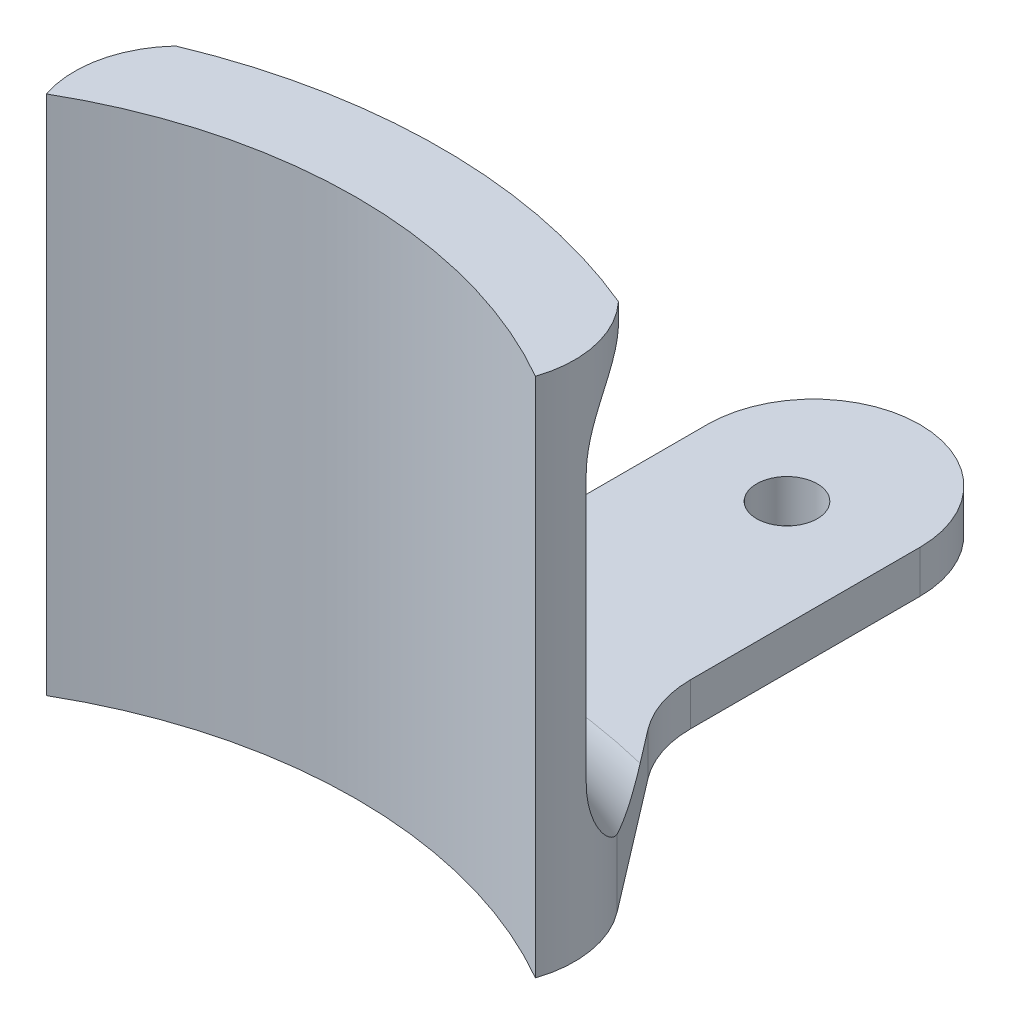
ISO-10303-21;
HEADER;
FILE_DESCRIPTION(('STEP AP214'),'2;1');
FILE_NAME('part.step','',(''),(''),'','','');
FILE_SCHEMA(('AUTOMOTIVE_DESIGN { 1 0 10303 214 1 1 1 1 }'));
ENDSEC;
DATA;
#1=APPLICATION_CONTEXT('core data for automotive mechanical design processes');
#2=APPLICATION_PROTOCOL_DEFINITION('international standard','automotive_design',2000,#1);
#3=PRODUCT_CONTEXT('',#1,'mechanical');
#4=PRODUCT('Part','Part','',(#3));
#5=PRODUCT_RELATED_PRODUCT_CATEGORY('part','',(#4));
#6=PRODUCT_DEFINITION_FORMATION('','',#4);
#7=PRODUCT_DEFINITION_CONTEXT('part definition',#1,'design');
#8=PRODUCT_DEFINITION('design','',#6,#7);
#9=PRODUCT_DEFINITION_SHAPE('','',#8);
#10=(LENGTH_UNIT() NAMED_UNIT(*) SI_UNIT(.MILLI.,.METRE.));
#11=(NAMED_UNIT(*) PLANE_ANGLE_UNIT() SI_UNIT($,.RADIAN.));
#12=(NAMED_UNIT(*) SI_UNIT($,.STERADIAN.) SOLID_ANGLE_UNIT());
#13=UNCERTAINTY_MEASURE_WITH_UNIT(LENGTH_MEASURE(1.E-05),#10,'distance_accuracy_value','');
#14=(GEOMETRIC_REPRESENTATION_CONTEXT(3) GLOBAL_UNCERTAINTY_ASSIGNED_CONTEXT((#13)) GLOBAL_UNIT_ASSIGNED_CONTEXT((#10,
#11,#12)) REPRESENTATION_CONTEXT('',''));
#15=CARTESIAN_POINT('',(0.,0.,0.));
#16=DIRECTION('',(0.,0.,1.));
#17=DIRECTION('',(1.,0.,0.));
#18=AXIS2_PLACEMENT_3D('',#15,#16,#17);
#19=CARTESIAN_POINT('',(0.,4.,73.9897948556636));
#20=DIRECTION('',(0.,-1.,0.));
#21=DIRECTION('',(0.,0.,-1.));
#22=AXIS2_PLACEMENT_3D('',#19,#20,#21);
#23=CYLINDRICAL_SURFACE('',#22,50.);
#24=CARTESIAN_POINT('',(0.,14.,73.9897948556636));
#25=DIRECTION('',(0.,1.,0.));
#26=DIRECTION('',(0.,0.,1.));
#27=AXIS2_PLACEMENT_3D('',#24,#25,#26);
#28=CIRCLE('',#27,50.);
#29=CARTESIAN_POINT('',(23.4431854635775,14.,29.8262685548765));
#30=VERTEX_POINT('',#29);
#31=CARTESIAN_POINT('',(-23.4431854635775,14.,29.8262685548765));
#32=VERTEX_POINT('',#31);
#33=EDGE_CURVE('E210',#30,#32,#28,.T.);
#34=ORIENTED_EDGE('',*,*,#33,.T.);
#35=DIRECTION('',(0.,-1.,0.));
#36=VECTOR('',#35,1.);
#37=CARTESIAN_POINT('',(-23.4431854635775,14.,29.8262685548765));
#38=LINE('',#37,#36);
#39=CARTESIAN_POINT('',(-23.4431854635775,39.,29.8262685548765));
#40=VERTEX_POINT('',#39);
#41=EDGE_CURVE('E280',#32,#40,#38,.F.);
#42=ORIENTED_EDGE('',*,*,#41,.T.);
#43=CARTESIAN_POINT('',(0.,39.,73.9897948556636));
#44=DIRECTION('',(0.,1.,0.));
#45=DIRECTION('',(0.,0.,1.));
#46=AXIS2_PLACEMENT_3D('',#43,#44,#45);
#47=CIRCLE('',#46,50.);
#48=CARTESIAN_POINT('',(23.4431854635775,39.,29.8262685548765));
#49=VERTEX_POINT('',#48);
#50=EDGE_CURVE('E331',#40,#49,#47,.F.);
#51=ORIENTED_EDGE('',*,*,#50,.T.);
#52=DIRECTION('',(0.,-1.,0.));
#53=VECTOR('',#52,1.);
#54=CARTESIAN_POINT('',(23.4431854635775,39.,29.8262685548765));
#55=LINE('',#54,#53);
#56=EDGE_CURVE('E368',#49,#30,#55,.T.);
#57=ORIENTED_EDGE('',*,*,#56,.T.);
#58=EDGE_LOOP('',(#34,#42,#51,#57));
#59=FACE_BOUND('',#58,.T.);
#60=ADVANCED_FACE('F47',(#59),#23,.T.);
#61=CARTESIAN_POINT('',(-10.,4.,0.));
#62=DIRECTION('',(1.,0.,0.));
#63=DIRECTION('',(0.,0.,-1.));
#64=AXIS2_PLACEMENT_3D('',#61,#62,#63);
#65=PLANE('',#64);
#66=DIRECTION('',(0.,0.,1.));
#67=VECTOR('',#66,1.);
#68=CARTESIAN_POINT('',(-10.,0.,0.));
#69=LINE('',#68,#67);
#70=CARTESIAN_POINT('',(-10.,0.,-15.));
#71=VERTEX_POINT('',#70);
#72=CARTESIAN_POINT('',(-10.,0.,6.55850585905922));
#73=VERTEX_POINT('',#72);
#74=EDGE_CURVE('E200',#71,#73,#69,.T.);
#75=ORIENTED_EDGE('',*,*,#74,.T.);
#76=DIRECTION('',(0.,1.,0.));
#77=VECTOR('',#76,1.);
#78=CARTESIAN_POINT('',(-10.,4.,6.55850585905922));
#79=LINE('',#78,#77);
#80=CARTESIAN_POINT('',(-10.,4.,6.55850585905922));
#81=VERTEX_POINT('',#80);
#82=EDGE_CURVE('E302',#73,#81,#79,.T.);
#83=ORIENTED_EDGE('',*,*,#82,.T.);
#84=DIRECTION('',(0.,0.,1.));
#85=VECTOR('',#84,1.);
#86=CARTESIAN_POINT('',(-10.,4.,0.));
#87=LINE('',#86,#85);
#88=CARTESIAN_POINT('',(-10.,4.,-15.));
#89=VERTEX_POINT('',#88);
#90=EDGE_CURVE('E317',#89,#81,#87,.T.);
#91=ORIENTED_EDGE('',*,*,#90,.F.);
#92=DIRECTION('',(0.,-1.,0.));
#93=VECTOR('',#92,1.);
#94=CARTESIAN_POINT('',(-10.,0.,-15.));
#95=LINE('',#94,#93);
#96=EDGE_CURVE('E300',#89,#71,#95,.T.);
#97=ORIENTED_EDGE('',*,*,#96,.T.);
#98=EDGE_LOOP('',(#75,#83,#91,#97));
#99=FACE_BOUND('',#98,.T.);
#100=ADVANCED_FACE('F371',(#99),#65,.F.);
#101=CARTESIAN_POINT('',(0.,4.,73.9897948556636));
#102=DIRECTION('',(0.,-1.,0.));
#103=DIRECTION('',(0.,0.,-1.));
#104=AXIS2_PLACEMENT_3D('',#101,#102,#103);
#105=CYLINDRICAL_SURFACE('',#104,46.);
#106=CARTESIAN_POINT('',(0.,0.,73.9897948556636));
#107=DIRECTION('',(0.,1.,0.));
#108=DIRECTION('',(0.,0.,1.));
#109=AXIS2_PLACEMENT_3D('',#106,#107,#108);
#110=CIRCLE('',#109,46.);
#111=CARTESIAN_POINT('',(23.0000000000001,0.,34.1526262815794));
#112=VERTEX_POINT('',#111);
#113=CARTESIAN_POINT('',(-23.0000000000001,0.,34.1526262815794));
#114=VERTEX_POINT('',#113);
#115=EDGE_CURVE('E347',#112,#114,#110,.T.);
#116=ORIENTED_EDGE('',*,*,#115,.F.);
#117=DIRECTION('',(0.,-1.,0.));
#118=VECTOR('',#117,1.);
#119=CARTESIAN_POINT('',(23.0000000000001,4.,34.1526262815794));
#120=LINE('',#119,#118);
#121=CARTESIAN_POINT('',(23.0000000000001,49.,34.1526262815794));
#122=VERTEX_POINT('',#121);
#123=EDGE_CURVE('E181',#122,#112,#120,.T.);
#124=ORIENTED_EDGE('',*,*,#123,.F.);
#125=CARTESIAN_POINT('',(0.,49.,73.9897948556636));
#126=DIRECTION('',(0.,1.,0.));
#127=DIRECTION('',(0.,0.,1.));
#128=AXIS2_PLACEMENT_3D('',#125,#126,#127);
#129=CIRCLE('',#128,46.);
#130=CARTESIAN_POINT('',(-23.0000000000001,49.,34.1526262815794));
#131=VERTEX_POINT('',#130);
#132=EDGE_CURVE('E164',#131,#122,#129,.F.);
#133=ORIENTED_EDGE('',*,*,#132,.F.);
#134=DIRECTION('',(0.,-1.,0.));
#135=VECTOR('',#134,1.);
#136=CARTESIAN_POINT('',(-23.0000000000001,4.,34.1526262815794));
#137=LINE('',#136,#135);
#138=EDGE_CURVE('E178',#131,#114,#137,.T.);
#139=ORIENTED_EDGE('',*,*,#138,.T.);
#140=EDGE_LOOP('',(#116,#124,#133,#139));
#141=FACE_BOUND('',#140,.T.);
#142=ADVANCED_FACE('F177',(#141),#105,.F.);
#143=CARTESIAN_POINT('',(10.,4.,0.));
#144=DIRECTION('',(1.,0.,0.));
#145=DIRECTION('',(0.,0.,-1.));
#146=AXIS2_PLACEMENT_3D('',#143,#144,#145);
#147=PLANE('',#146);
#148=DIRECTION('',(0.,0.,1.));
#149=VECTOR('',#148,1.);
#150=CARTESIAN_POINT('',(10.,4.,0.));
#151=LINE('',#150,#149);
#152=CARTESIAN_POINT('',(10.,4.,-15.));
#153=VERTEX_POINT('',#152);
#154=CARTESIAN_POINT('',(10.,4.,6.55850585905923));
#155=VERTEX_POINT('',#154);
#156=EDGE_CURVE('E194',#153,#155,#151,.T.);
#157=ORIENTED_EDGE('',*,*,#156,.T.);
#158=DIRECTION('',(0.,-1.,0.));
#159=VECTOR('',#158,1.);
#160=CARTESIAN_POINT('',(10.,4.,6.55850585905923));
#161=LINE('',#160,#159);
#162=CARTESIAN_POINT('',(10.,0.,6.55850585905923));
#163=VERTEX_POINT('',#162);
#164=EDGE_CURVE('E297',#155,#163,#161,.T.);
#165=ORIENTED_EDGE('',*,*,#164,.T.);
#166=DIRECTION('',(0.,0.,1.));
#167=VECTOR('',#166,1.);
#168=CARTESIAN_POINT('',(10.,0.,0.));
#169=LINE('',#168,#167);
#170=CARTESIAN_POINT('',(10.,0.,-15.));
#171=VERTEX_POINT('',#170);
#172=EDGE_CURVE('E348',#171,#163,#169,.T.);
#173=ORIENTED_EDGE('',*,*,#172,.F.);
#174=DIRECTION('',(0.,-1.,0.));
#175=VECTOR('',#174,1.);
#176=CARTESIAN_POINT('',(10.,4.,-15.));
#177=LINE('',#176,#175);
#178=EDGE_CURVE('E294',#171,#153,#177,.F.);
#179=ORIENTED_EDGE('',*,*,#178,.T.);
#180=EDGE_LOOP('',(#157,#165,#173,#179));
#181=FACE_BOUND('',#180,.T.);
#182=ADVANCED_FACE('F381',(#181),#147,.T.);
#183=CARTESIAN_POINT('',(0.,4.,0.));
#184=DIRECTION('',(0.,1.,0.));
#185=DIRECTION('',(0.,0.,1.));
#186=AXIS2_PLACEMENT_3D('',#183,#184,#185);
#187=PLANE('',#186);
#188=ORIENTED_EDGE('',*,*,#156,.F.);
#189=CARTESIAN_POINT('',(0.,4.,-15.));
#190=DIRECTION('',(0.,1.,0.));
#191=DIRECTION('',(0.,0.,1.));
#192=AXIS2_PLACEMENT_3D('',#189,#190,#191);
#193=CIRCLE('',#192,10.);
#194=CARTESIAN_POINT('',(0.,4.,-25.));
#195=VERTEX_POINT('',#194);
#196=EDGE_CURVE('E63',#153,#195,#193,.T.);
#197=ORIENTED_EDGE('',*,*,#196,.T.);
#198=CARTESIAN_POINT('',(0.,4.,-15.));
#199=DIRECTION('',(0.,1.,0.));
#200=DIRECTION('',(0.,0.,1.));
#201=AXIS2_PLACEMENT_3D('',#198,#199,#200);
#202=CIRCLE('',#201,10.);
#203=EDGE_CURVE('E304',#195,#89,#202,.T.);
#204=ORIENTED_EDGE('',*,*,#203,.T.);
#205=ORIENTED_EDGE('',*,*,#90,.T.);
#206=CARTESIAN_POINT('',(-20.,4.,6.55850585905922));
#207=DIRECTION('',(0.,1.,0.));
#208=DIRECTION('',(0.,0.,1.));
#209=AXIS2_PLACEMENT_3D('',#206,#207,#208);
#210=CIRCLE('',#209,10.);
#211=CARTESIAN_POINT('',(-12.0572635614547,4.,12.6341077113702));
#212=VERTEX_POINT('',#211);
#213=EDGE_CURVE('E56',#81,#212,#210,.F.);
#214=ORIENTED_EDGE('',*,*,#213,.T.);
#215=DIRECTION('',(-0.607560185231101,0.,0.794273643854529));
#216=VECTOR('',#215,1.);
#217=CARTESIAN_POINT('',(-26.6095830560295,4.,31.6585996258538));
#218=LINE('',#217,#216);
#219=CARTESIAN_POINT('',(-14.4439893944825,4.,15.7543145161654));
#220=VERTEX_POINT('',#219);
#221=EDGE_CURVE('E207',#212,#220,#218,.T.);
#222=ORIENTED_EDGE('',*,*,#221,.T.);
#223=CARTESIAN_POINT('',(0.,4.,73.9897948556636));
#224=DIRECTION('',(0.,1.,0.));
#225=DIRECTION('',(0.,0.,1.));
#226=AXIS2_PLACEMENT_3D('',#223,#224,#225);
#227=CIRCLE('',#226,60.);
#228=CARTESIAN_POINT('',(14.4439893944825,4.,15.7543145161654));
#229=VERTEX_POINT('',#228);
#230=EDGE_CURVE('E213',#220,#229,#227,.F.);
#231=ORIENTED_EDGE('',*,*,#230,.T.);
#232=DIRECTION('',(-0.607560185231101,0.,-0.794273643854528));
#233=VECTOR('',#232,1.);
#234=CARTESIAN_POINT('',(10.,4.,9.9446124727969));
#235=LINE('',#234,#233);
#236=CARTESIAN_POINT('',(12.0572635614547,4.,12.6341077113702));
#237=VERTEX_POINT('',#236);
#238=EDGE_CURVE('E192',#229,#237,#235,.T.);
#239=ORIENTED_EDGE('',*,*,#238,.T.);
#240=CARTESIAN_POINT('',(20.,4.,6.55850585905923));
#241=DIRECTION('',(0.,1.,0.));
#242=DIRECTION('',(0.,0.,1.));
#243=AXIS2_PLACEMENT_3D('',#240,#241,#242);
#244=CIRCLE('',#243,10.);
#245=EDGE_CURVE('E309',#237,#155,#244,.F.);
#246=ORIENTED_EDGE('',*,*,#245,.T.);
#247=EDGE_LOOP('',(#188,#197,#204,#205,#214,#222,#231,#239,#246));
#248=FACE_BOUND('',#247,.T.);
#249=CARTESIAN_POINT('',(0.,4.,-12.5));
#250=DIRECTION('',(0.,1.,0.));
#251=DIRECTION('',(0.,0.,1.));
#252=AXIS2_PLACEMENT_3D('',#249,#250,#251);
#253=CIRCLE('',#252,2.85);
#254=CARTESIAN_POINT('',(0.,4.,-9.65));
#255=VERTEX_POINT('',#254);
#256=EDGE_CURVE('E182',#255,#255,#253,.T.);
#257=ORIENTED_EDGE('',*,*,#256,.F.);
#258=EDGE_LOOP('',(#257));
#259=FACE_BOUND('',#258,.T.);
#260=ADVANCED_FACE('F313',(#248,#259),#187,.T.);
#261=CARTESIAN_POINT('',(0.,0.,0.));
#262=DIRECTION('',(0.,1.,0.));
#263=DIRECTION('',(0.,0.,1.));
#264=AXIS2_PLACEMENT_3D('',#261,#262,#263);
#265=PLANE('',#264);
#266=CARTESIAN_POINT('',(0.,0.,-12.5));
#267=DIRECTION('',(0.,1.,0.));
#268=DIRECTION('',(0.,0.,1.));
#269=AXIS2_PLACEMENT_3D('',#266,#267,#268);
#270=CIRCLE('',#269,2.85);
#271=CARTESIAN_POINT('',(0.,0.,-9.65));
#272=VERTEX_POINT('',#271);
#273=EDGE_CURVE('E198',#272,#272,#270,.T.);
#274=ORIENTED_EDGE('',*,*,#273,.T.);
#275=EDGE_LOOP('',(#274));
#276=FACE_BOUND('',#275,.T.);
#277=ORIENTED_EDGE('',*,*,#115,.T.);
#278=CARTESIAN_POINT('',(-13.5116910587682,0.,30.9947799528705));
#279=DIRECTION('',(0.,1.,0.));
#280=DIRECTION('',(0.,0.,1.));
#281=AXIS2_PLACEMENT_3D('',#278,#279,#280);
#282=CIRCLE('',#281,10.);
#283=CARTESIAN_POINT('',(-21.4544274973135,0.,24.9191781005595));
#284=VERTEX_POINT('',#283);
#285=EDGE_CURVE('E188',#114,#284,#282,.F.);
#286=ORIENTED_EDGE('',*,*,#285,.T.);
#287=DIRECTION('',(0.607560185231101,0.,-0.794273643854529));
#288=VECTOR('',#287,1.);
#289=CARTESIAN_POINT('',(-1.50974409732648,0.,-1.15484179856689));
#290=LINE('',#289,#288);
#291=CARTESIAN_POINT('',(-12.0572635614547,0.,12.6341077113702));
#292=VERTEX_POINT('',#291);
#293=EDGE_CURVE('E204',#284,#292,#290,.T.);
#294=ORIENTED_EDGE('',*,*,#293,.T.);
#295=CARTESIAN_POINT('',(-20.,0.,6.55850585905922));
#296=DIRECTION('',(0.,1.,0.));
#297=DIRECTION('',(0.,0.,1.));
#298=AXIS2_PLACEMENT_3D('',#295,#296,#297);
#299=CIRCLE('',#298,10.);
#300=EDGE_CURVE('E11',#292,#73,#299,.T.);
#301=ORIENTED_EDGE('',*,*,#300,.T.);
#302=ORIENTED_EDGE('',*,*,#74,.F.);
#303=CARTESIAN_POINT('',(0.,0.,-15.));
#304=DIRECTION('',(0.,1.,0.));
#305=DIRECTION('',(0.,0.,1.));
#306=AXIS2_PLACEMENT_3D('',#303,#304,#305);
#307=CIRCLE('',#306,10.);
#308=CARTESIAN_POINT('',(0.,0.,-25.));
#309=VERTEX_POINT('',#308);
#310=EDGE_CURVE('E330',#71,#309,#307,.F.);
#311=ORIENTED_EDGE('',*,*,#310,.T.);
#312=CARTESIAN_POINT('',(0.,0.,-15.));
#313=DIRECTION('',(0.,1.,0.));
#314=DIRECTION('',(0.,0.,1.));
#315=AXIS2_PLACEMENT_3D('',#312,#313,#314);
#316=CIRCLE('',#315,10.);
#317=EDGE_CURVE('E328',#309,#171,#316,.F.);
#318=ORIENTED_EDGE('',*,*,#317,.T.);
#319=ORIENTED_EDGE('',*,*,#172,.T.);
#320=CARTESIAN_POINT('',(20.,0.,6.55850585905923));
#321=DIRECTION('',(0.,1.,0.));
#322=DIRECTION('',(0.,0.,1.));
#323=AXIS2_PLACEMENT_3D('',#320,#321,#322);
#324=CIRCLE('',#323,10.);
#325=CARTESIAN_POINT('',(12.0572635614547,0.,12.6341077113702));
#326=VERTEX_POINT('',#325);
#327=EDGE_CURVE('E307',#163,#326,#324,.T.);
#328=ORIENTED_EDGE('',*,*,#327,.T.);
#329=DIRECTION('',(0.607560185231101,0.,0.794273643854528));
#330=VECTOR('',#329,1.);
#331=CARTESIAN_POINT('',(1.50974409732648,0.,-1.15484179856688));
#332=LINE('',#331,#330);
#333=CARTESIAN_POINT('',(21.4544274973135,0.,24.9191781005595));
#334=VERTEX_POINT('',#333);
#335=EDGE_CURVE('E189',#326,#334,#332,.T.);
#336=ORIENTED_EDGE('',*,*,#335,.T.);
#337=CARTESIAN_POINT('',(13.5116910587682,0.,30.9947799528705));
#338=DIRECTION('',(0.,1.,0.));
#339=DIRECTION('',(0.,0.,1.));
#340=AXIS2_PLACEMENT_3D('',#337,#338,#339);
#341=CIRCLE('',#340,10.);
#342=EDGE_CURVE('E324',#334,#112,#341,.F.);
#343=ORIENTED_EDGE('',*,*,#342,.T.);
#344=EDGE_LOOP('',(#277,#286,#294,#301,#302,#311,#318,#319,#328,#336,#343));
#345=FACE_BOUND('',#344,.T.);
#346=ADVANCED_FACE('F346',(#276,#345),#265,.F.);
#347=CARTESIAN_POINT('',(0.,-6.,-12.5));
#348=DIRECTION('',(0.,1.,0.));
#349=DIRECTION('',(0.,0.,1.));
#350=AXIS2_PLACEMENT_3D('',#347,#348,#349);
#351=CYLINDRICAL_SURFACE('',#350,2.85);
#352=ORIENTED_EDGE('',*,*,#256,.T.);
#353=EDGE_LOOP('',(#352));
#354=FACE_BOUND('',#353,.T.);
#355=ORIENTED_EDGE('',*,*,#273,.F.);
#356=EDGE_LOOP('',(#355));
#357=FACE_BOUND('',#356,.T.);
#358=ADVANCED_FACE('F393',(#354,#357),#351,.F.);
#359=CARTESIAN_POINT('',(0.,49.,0.));
#360=DIRECTION('',(0.,1.,0.));
#361=DIRECTION('',(0.,0.,1.));
#362=AXIS2_PLACEMENT_3D('',#359,#360,#361);
#363=PLANE('',#362);
#364=CARTESIAN_POINT('',(0.,49.,73.9897948556636));
#365=DIRECTION('',(0.,1.,0.));
#366=DIRECTION('',(0.,0.,1.));
#367=AXIS2_PLACEMENT_3D('',#364,#365,#366);
#368=CIRCLE('',#367,54.);
#369=CARTESIAN_POINT('',(20.8132978768946,49.,24.1620251736112));
#370=VERTEX_POINT('',#369);
#371=CARTESIAN_POINT('',(-20.8132978768947,49.,24.1620251736112));
#372=VERTEX_POINT('',#371);
#373=EDGE_CURVE('E166',#370,#372,#368,.T.);
#374=ORIENTED_EDGE('',*,*,#373,.T.);
#375=CARTESIAN_POINT('',(-13.5116910587682,49.,30.9947799528705));
#376=DIRECTION('',(0.,1.,0.));
#377=DIRECTION('',(0.,0.,1.));
#378=AXIS2_PLACEMENT_3D('',#375,#376,#377);
#379=CIRCLE('',#378,10.);
#380=EDGE_CURVE('E161',#372,#131,#379,.T.);
#381=ORIENTED_EDGE('',*,*,#380,.T.);
#382=ORIENTED_EDGE('',*,*,#132,.T.);
#383=CARTESIAN_POINT('',(13.5116910587682,49.,30.9947799528705));
#384=DIRECTION('',(0.,1.,0.));
#385=DIRECTION('',(0.,0.,1.));
#386=AXIS2_PLACEMENT_3D('',#383,#384,#385);
#387=CIRCLE('',#386,10.);
#388=EDGE_CURVE('E171',#122,#370,#387,.T.);
#389=ORIENTED_EDGE('',*,*,#388,.T.);
#390=EDGE_LOOP('',(#374,#381,#382,#389));
#391=FACE_BOUND('',#390,.T.);
#392=ADVANCED_FACE('F163',(#391),#363,.T.);
#393=CARTESIAN_POINT('',(10.,4.,9.9446124727969));
#394=DIRECTION('',(-0.794273643854528,0.,0.607560185231101));
#395=DIRECTION('',(0.,-1.,0.));
#396=AXIS2_PLACEMENT_3D('',#393,#394,#395);
#397=PLANE('',#396);
#398=CARTESIAN_POINT('',(14.4439893944825,4.,15.7543145161654));
#399=CARTESIAN_POINT('',(14.6847397267468,4.00002028185486,16.0690514727914));
#400=CARTESIAN_POINT('',(14.9254631113111,4.00918996947061,16.3837532002362));
#401=CARTESIAN_POINT('',(15.4063856833093,4.04490329008641,17.0124713634048));
#402=CARTESIAN_POINT('',(15.6465849724752,4.0714431807701,17.3264879321247));
#403=CARTESIAN_POINT('',(16.1259623880331,4.1409538885757,17.9531860863033));
#404=CARTESIAN_POINT('',(16.3651409998068,4.18391573877264,18.2658683063097));
#405=CARTESIAN_POINT('',(16.8422781185334,4.28549817493546,18.8896376827791));
#406=CARTESIAN_POINT('',(17.0802365485236,4.3441197365478,19.2007247386274));
#407=CARTESIAN_POINT('',(17.5588967757427,4.47754521782158,19.8264853004341));
#408=CARTESIAN_POINT('',(17.7995703786268,4.55262257363715,20.1411219474514));
#409=CARTESIAN_POINT('',(18.279017071295,4.71773215653088,20.7679106687609));
#410=CARTESIAN_POINT('',(18.5177901242902,4.80776467236148,21.0800626949583));
#411=CARTESIAN_POINT('',(18.9931498545429,5.0023404089394,21.7015084615961));
#412=CARTESIAN_POINT('',(19.2297364924792,5.10688389011728,22.0108021506311));
#413=CARTESIAN_POINT('',(19.7004003748242,5.33018122818084,22.6261089563572));
#414=CARTESIAN_POINT('',(19.9344776929236,5.44893466651349,22.9321221693853));
#415=CARTESIAN_POINT('',(20.5342583788546,5.77318717364343,23.7162255430235));
#416=CARTESIAN_POINT('',(20.8979049066335,5.9891751457064,24.1916267620553));
#417=CARTESIAN_POINT('',(21.4369508779327,6.33987216727671,24.8963306222433));
#418=CARTESIAN_POINT('',(21.615596464673,6.46124997887474,25.129877001002));
#419=CARTESIAN_POINT('',(21.9704797596674,6.71317905800233,25.5938218984958));
#420=CARTESIAN_POINT('',(22.1467176517138,6.84372962060045,25.8242206575055));
#421=CARTESIAN_POINT('',(22.4951656611507,7.11338108574133,26.2797525980062));
#422=CARTESIAN_POINT('',(22.6673959818117,7.25241120678068,26.5049121915725));
#423=CARTESIAN_POINT('',(23.008739959859,7.54043463176502,26.9511569124115));
#424=CARTESIAN_POINT('',(23.1778539432158,7.6894268860324,27.1722424658312));
#425=CARTESIAN_POINT('',(23.5123050272062,7.99807184334005,27.6094759903933));
#426=CARTESIAN_POINT('',(23.677644691504,8.15771700273269,27.825627313057));
#427=CARTESIAN_POINT('',(24.0038700270162,8.4888319337673,28.2521071783502));
#428=CARTESIAN_POINT('',(24.1647567907521,8.66029876825874,28.4624371492516));
#429=CARTESIAN_POINT('',(24.4150110467008,8.94228148900398,28.7895987450807));
#430=CARTESIAN_POINT('',(24.5062171543876,9.04838661761705,28.9088340229267));
#431=CARTESIAN_POINT('',(24.686415604651,9.26551753947505,29.1444104862745));
#432=CARTESIAN_POINT('',(24.7754084496629,9.37654219971508,29.2607523286184));
#433=CARTESIAN_POINT('',(24.951039991603,9.60426673980628,29.4903583959407));
#434=CARTESIAN_POINT('',(25.0376723597417,9.72097990705,29.6036143471863));
#435=CARTESIAN_POINT('',(25.2078666683383,9.9604695429109,29.8261122279533));
#436=CARTESIAN_POINT('',(25.2914268131072,10.0832494622375,29.9353518099403));
#437=CARTESIAN_POINT('',(25.3731565808369,10.2093166977196,30.0421985092535));
#438=B_SPLINE_CURVE_WITH_KNOTS('',3,(#398,#399,#400,#401,#402,#403,#404,#405,#406,#407,#408,
#409,#410,#411,#412,#413,#414,#415,#416,#417,#418,#419,#420,#421,#422,#423,#424,#425,#426,#427,
#428,#429,#430,#431,#432,#433,#434,#435,#436,#437),.UNSPECIFIED.,.F.,.F.,(4,2,2,2,2,2,2,2,2,2,2,
2,2,2,2,2,2,2,2,4),(0.,1.18860308579,2.37695017772771,3.56464931821001,4.75242247313587,
5.96167240056694,7.17094567876618,8.38024066278887,9.58950003589886,11.4971470971529,
12.4513430975792,13.4054658475052,14.3524953321085,15.2994251880628,16.2456914676379,
17.1917234843235,17.7431321306539,18.2944144368897,18.847052707262,19.4000090148884),.UNSPECIFIED.);
#439=CARTESIAN_POINT('',(21.4544274973137,6.35332847759931,24.9191781005597));
#440=VERTEX_POINT('',#439);
#441=EDGE_CURVE('E223',#229,#440,#438,.T.);
#442=ORIENTED_EDGE('',*,*,#441,.T.);
#443=DIRECTION('',(0.,-1.,0.));
#444=VECTOR('',#443,1.);
#445=CARTESIAN_POINT('',(21.4544274973135,4.,24.9191781005595));
#446=LINE('',#445,#444);
#447=EDGE_CURVE('E292',#440,#334,#446,.T.);
#448=ORIENTED_EDGE('',*,*,#447,.T.);
#449=ORIENTED_EDGE('',*,*,#335,.F.);
#450=DIRECTION('',(0.,-1.,0.));
#451=VECTOR('',#450,1.);
#452=CARTESIAN_POINT('',(12.0572635614547,4.,12.6341077113702));
#453=LINE('',#452,#451);
#454=EDGE_CURVE('E170',#326,#237,#453,.F.);
#455=ORIENTED_EDGE('',*,*,#454,.T.);
#456=ORIENTED_EDGE('',*,*,#238,.F.);
#457=EDGE_LOOP('',(#442,#448,#449,#455,#456));
#458=FACE_BOUND('',#457,.T.);
#459=ADVANCED_FACE('F341',(#458),#397,.F.);
#460=CARTESIAN_POINT('',(-26.6095830560295,4.,31.6585996258538));
#461=DIRECTION('',(0.794273643854528,0.,0.607560185231101));
#462=DIRECTION('',(0.,-1.,0.));
#463=AXIS2_PLACEMENT_3D('',#460,#461,#462);
#464=PLANE('',#463);
#465=ORIENTED_EDGE('',*,*,#293,.F.);
#466=DIRECTION('',(0.,-1.,0.));
#467=VECTOR('',#466,1.);
#468=CARTESIAN_POINT('',(-21.4544274973135,4.,24.9191781005595));
#469=LINE('',#468,#467);
#470=CARTESIAN_POINT('',(-21.4544274973135,6.35332847759921,24.9191781005595));
#471=VERTEX_POINT('',#470);
#472=EDGE_CURVE('E255',#284,#471,#469,.F.);
#473=ORIENTED_EDGE('',*,*,#472,.T.);
#474=CARTESIAN_POINT('',(-25.3731565808369,10.2093166977196,30.0421985092535));
#475=CARTESIAN_POINT('',(-25.2790230130738,10.0641498373032,29.9191361136362));
#476=CARTESIAN_POINT('',(-25.1824836618645,9.92332961138887,29.792928596876));
#477=CARTESIAN_POINT('',(-24.9854333779814,9.64961578119983,29.5353214481409));
#478=CARTESIAN_POINT('',(-24.8849248857754,9.51671742845174,29.4039250066305));
#479=CARTESIAN_POINT('',(-24.6809029869163,9.25821429890952,29.1372037484372));
#480=CARTESIAN_POINT('',(-24.5773972844431,9.13259294839756,29.0018890035583));
#481=CARTESIAN_POINT('',(-24.3676562301919,8.88764012303419,28.7276909973763));
#482=CARTESIAN_POINT('',(-24.2614203929168,8.76830977858101,28.5888071013746));
#483=CARTESIAN_POINT('',(-23.939522963402,8.41921466296403,28.1679851803481));
#484=CARTESIAN_POINT('',(-23.7204155458607,8.19802728848814,27.8815423699788));
#485=CARTESIAN_POINT('',(-23.2751240991452,7.775299253216,27.2994053758875));
#486=CARTESIAN_POINT('',(-23.0489338372778,7.5737765773054,27.0037030440609));
#487=CARTESIAN_POINT('',(-22.5848519644809,7.18339768854678,26.3970010100673));
#488=CARTESIAN_POINT('',(-22.3468092848535,6.99502920841637,26.0858038132519));
#489=CARTESIAN_POINT('',(-21.8658794396155,6.63575950906386,25.4570761416546));
#490=CARTESIAN_POINT('',(-21.6229915157024,6.46486105002147,25.1395446755311));
#491=CARTESIAN_POINT('',(-21.1330234533005,6.13974457052217,24.4990011906939));
#492=CARTESIAN_POINT('',(-20.8859416829854,5.98553322351843,24.1759870386662));
#493=CARTESIAN_POINT('',(-20.3882378256965,5.69354802484573,23.5253304191266));
#494=CARTESIAN_POINT('',(-20.1376159337781,5.55577327146574,23.1976882066139));
#495=CARTESIAN_POINT('',(-19.6325438933348,5.29627956819212,22.5373990373699));
#496=CARTESIAN_POINT('',(-19.3780849171644,5.17460716582882,22.2047405401094));
#497=CARTESIAN_POINT('',(-18.8664189740052,4.94803260930767,21.5358310509948));
#498=CARTESIAN_POINT('',(-18.6092119430073,4.84313084669233,21.1995799754606));
#499=CARTESIAN_POINT('',(-18.0925983823806,4.65064293549157,20.5242023828561));
#500=CARTESIAN_POINT('',(-17.8331935188281,4.56304471472281,20.1850780438755));
#501=CARTESIAN_POINT('',(-17.3124115644382,4.40575014340478,19.5042510400296));
#502=CARTESIAN_POINT('',(-17.0510345627818,4.33605298829572,19.1625484917522));
#503=CARTESIAN_POINT('',(-16.3995365566509,4.18613001137042,18.3108341959961));
#504=CARTESIAN_POINT('',(-16.0084160757627,4.11717352300231,17.7995158161997));
#505=CARTESIAN_POINT('',(-15.4213271939471,4.04740900555183,17.0320046514435));
#506=CARTESIAN_POINT('',(-15.2260525612587,4.0297683043864,16.7767188413656));
#507=CARTESIAN_POINT('',(-14.8351915453186,4.00606646538033,16.2657396644577));
#508=CARTESIAN_POINT('',(-14.6396050905244,4.0000085461667,16.0100462040989));
#509=CARTESIAN_POINT('',(-14.4439893944825,4.,15.7543145161654));
#510=B_SPLINE_CURVE_WITH_KNOTS('',3,(#474,#475,#476,#477,#478,#479,#480,#481,#482,#483,#484,
#485,#486,#487,#488,#489,#490,#491,#492,#493,#494,#495,#496,#497,#498,#499,#500,#501,#502,#503,
#504,#505,#506,#507,#508,#509),.UNSPECIFIED.,.F.,.F.,(4,2,2,2,2,2,2,2,2,2,2,2,2,2,2,2,2,4),(0.,
0.636752656955592,1.27311971642861,1.90797529861605,2.5429445686038,3.81130214692595,
5.08080907260724,6.38452948590636,7.68845556346121,8.99290119037503,10.2972752225016,
11.6053411121196,12.913437536569,14.2206180912073,15.5277398845939,17.4683855779197,
18.4338830640281,19.399648803905),.UNSPECIFIED.);
#511=EDGE_CURVE('E215',#471,#220,#510,.T.);
#512=ORIENTED_EDGE('',*,*,#511,.T.);
#513=ORIENTED_EDGE('',*,*,#221,.F.);
#514=DIRECTION('',(0.,1.,0.));
#515=VECTOR('',#514,1.);
#516=CARTESIAN_POINT('',(-12.0572635614547,0.,12.6341077113702));
#517=LINE('',#516,#515);
#518=EDGE_CURVE('E320',#212,#292,#517,.F.);
#519=ORIENTED_EDGE('',*,*,#518,.T.);
#520=EDGE_LOOP('',(#465,#473,#512,#513,#519));
#521=FACE_BOUND('',#520,.T.);
#522=ADVANCED_FACE('F231',(#521),#464,.F.);
#523=CARTESIAN_POINT('',(0.,14.,73.9897948556636));
#524=DIRECTION('',(0.,1.,0.));
#525=DIRECTION('',(0.,0.,1.));
#526=AXIS2_PLACEMENT_3D('',#523,#524,#525);
#527=TOROIDAL_SURFACE('',#526,60.,10.);
#528=ORIENTED_EDGE('',*,*,#511,.F.);
#529=CARTESIAN_POINT('',(-21.4544274973135,6.3533284775992,24.9191781005595));
#530=CARTESIAN_POINT('',(-21.5158935624383,6.39462483831497,24.9995308096876));
#531=CARTESIAN_POINT('',(-21.575758025339,6.43741935727823,25.0803231469782));
#532=CARTESIAN_POINT('',(-21.6922598546466,6.52610171226434,25.2425401849609));
#533=CARTESIAN_POINT('',(-21.7488970838922,6.57198967958177,25.3239649123634));
#534=CARTESIAN_POINT('',(-21.9139203391848,6.71443027175785,25.5688008987128));
#535=CARTESIAN_POINT('',(-22.0174225311436,6.81576265940405,25.7327800053624));
#536=CARTESIAN_POINT('',(-22.211084606897,7.03141685317529,26.0595413984481));
#537=CARTESIAN_POINT('',(-22.3012673397971,7.14571580553554,26.2223252683221));
#538=CARTESIAN_POINT('',(-22.4687249800179,7.38766530484859,26.5445546391666));
#539=CARTESIAN_POINT('',(-22.5460016336088,7.51531404168795,26.7040005892201));
#540=CARTESIAN_POINT('',(-22.6883718859346,7.78426344085836,27.0175612250733));
#541=CARTESIAN_POINT('',(-22.7534310914098,7.92560099425385,27.1716598936095));
#542=CARTESIAN_POINT('',(-22.8719249068816,8.22122955801328,27.4717059128804));
#543=CARTESIAN_POINT('',(-22.9253587968865,8.37552136985488,27.6176527583317));
#544=CARTESIAN_POINT('',(-23.0216253301901,8.69617859704882,27.8990957812206));
#545=CARTESIAN_POINT('',(-23.0644677407929,8.86253270421727,28.0346015073099));
#546=CARTESIAN_POINT('',(-23.1408654607958,9.20644830552871,28.2934433523027));
#547=CARTESIAN_POINT('',(-23.1744210997175,9.38400940174067,28.4167799029039));
#548=CARTESIAN_POINT('',(-23.2327293853767,9.74384189874219,28.6463679623605));
#549=CARTESIAN_POINT('',(-23.2577094016375,9.925826707994,28.753011650176));
#550=CARTESIAN_POINT('',(-23.3014118069669,10.2980319970481,28.9522865726121));
#551=CARTESIAN_POINT('',(-23.3201340884121,10.4882526184302,29.0449175662209));
#552=CARTESIAN_POINT('',(-23.3524954611879,10.8758415670038,29.2154232027468));
#553=CARTESIAN_POINT('',(-23.3661292516097,11.0732171143431,29.2932824159691));
#554=CARTESIAN_POINT('',(-23.3893193882773,11.473607264911,29.4335254675785));
#555=CARTESIAN_POINT('',(-23.3988760946287,11.6766213684304,29.4959106724929));
#556=CARTESIAN_POINT('',(-23.4135119280911,12.0544657126259,29.5961806440415));
#557=CARTESIAN_POINT('',(-23.4190604408156,12.228668527325,29.6363807395143));
#558=CARTESIAN_POINT('',(-23.4282756130745,12.5793532290906,29.7053781294247));
#559=CARTESIAN_POINT('',(-23.4319424603203,12.7558348870226,29.7341765612062));
#560=CARTESIAN_POINT('',(-23.4376867634462,13.1098834538813,29.7802115015865));
#561=CARTESIAN_POINT('',(-23.439768082669,13.2874466553479,29.7974761011249));
#562=CARTESIAN_POINT('',(-23.4425070063136,13.6433399731498,29.8205083922233));
#563=CARTESIAN_POINT('',(-23.4431645175562,13.821670138913,29.8262753313315));
#564=CARTESIAN_POINT('',(-23.4431854635775,14.,29.8262685548765));
#565=B_SPLINE_CURVE_WITH_KNOTS('',3,(#529,#530,#531,#532,#533,#534,#535,#536,#537,#538,#539,
#540,#541,#542,#543,#544,#545,#546,#547,#548,#549,#550,#551,#552,#553,#554,#555,#556,#557,#558,
#559,#560,#561,#562,#563,#564),.UNSPECIFIED.,.F.,.F.,(4,2,2,2,2,2,2,2,2,2,2,2,2,2,2,2,2,4),(0.,
0.327764484436118,0.655542888879195,1.3110751983056,1.96546956509779,2.61977531652325,
3.27589625818604,3.93205782389027,4.58761201091945,5.24314293400588,5.879634482143,
6.51613697639203,7.15330070515295,7.79040814521067,8.32663282712702,8.86280400583124,
9.39766451851573,9.93256003340716),.UNSPECIFIED.);
#566=EDGE_CURVE('E254',#471,#32,#565,.T.);
#567=ORIENTED_EDGE('',*,*,#566,.T.);
#568=ORIENTED_EDGE('',*,*,#33,.F.);
#569=CARTESIAN_POINT('',(23.4431854635775,14.,29.8262685548765));
#570=CARTESIAN_POINT('',(23.4431828658952,13.887452523818,29.8262681791346));
#571=CARTESIAN_POINT('',(23.4429158013912,13.7749179844379,29.8239737886218));
#572=CARTESIAN_POINT('',(23.4418309731717,13.5500403909836,29.8148002994908));
#573=CARTESIAN_POINT('',(23.4410132180697,13.437697333942,29.8079212725826));
#574=CARTESIAN_POINT('',(23.4377014657351,13.1012196672354,29.7804138410037));
#575=CARTESIAN_POINT('',(23.4343489891852,12.8776152732732,29.7529150840873));
#576=CARTESIAN_POINT('',(23.4249086332515,12.4330935077344,29.6796851173146));
#577=CARTESIAN_POINT('',(23.4188159855077,12.2121815126286,29.6339221403349));
#578=CARTESIAN_POINT('',(23.403160737814,11.774974416887,29.5244451468891));
#579=CARTESIAN_POINT('',(23.3935982996175,11.5586791015301,29.46073196725));
#580=CARTESIAN_POINT('',(23.3699903760714,11.1319284277682,29.3156916136445));
#581=CARTESIAN_POINT('',(23.3559376108106,10.9214831601555,29.234335906159));
#582=CARTESIAN_POINT('',(23.3221291434162,10.5083881530954,29.0547683712585));
#583=CARTESIAN_POINT('',(23.3023737079895,10.3057380495801,28.9565573322335));
#584=CARTESIAN_POINT('',(23.2558034979556,9.91009016395063,28.7444386050504));
#585=CARTESIAN_POINT('',(23.2290001435877,9.7170773624725,28.6305564509274));
#586=CARTESIAN_POINT('',(23.1668433909046,9.34181477903558,28.3883155084918));
#587=CARTESIAN_POINT('',(23.1314904408244,9.1595644334498,28.2599574793033));
#588=CARTESIAN_POINT('',(23.051864356945,8.81190659737731,27.99414585287));
#589=CARTESIAN_POINT('',(23.0078598990842,8.6461758867293,27.8570344584812));
#590=CARTESIAN_POINT('',(22.9091180162311,8.3270806436959,27.5726445157997));
#591=CARTESIAN_POINT('',(22.8543802907704,8.17371645767009,27.4253656829533));
#592=CARTESIAN_POINT('',(22.733080407054,7.87997088015059,27.1227570989199));
#593=CARTESIAN_POINT('',(22.6665109887961,7.7395975408052,26.9674224463131));
#594=CARTESIAN_POINT('',(22.5207767772368,7.47233437944049,26.6512037236255));
#595=CARTESIAN_POINT('',(22.4416144753472,7.34544189859497,26.4903207561598));
#596=CARTESIAN_POINT('',(22.2943367729055,7.13898189323627,26.2112067898065));
#597=CARTESIAN_POINT('',(22.2293771573543,7.05614223913527,26.0937072538572));
#598=CARTESIAN_POINT('',(22.0926316018801,6.89735546312998,25.858048294725));
#599=CARTESIAN_POINT('',(22.0208467319399,6.82140726450114,25.7398889776995));
#600=CARTESIAN_POINT('',(21.8705419281104,6.67634587573858,25.5039575794379));
#601=CARTESIAN_POINT('',(21.7920314178866,6.60722340502918,25.3861851889047));
#602=CARTESIAN_POINT('',(21.6282661468065,6.47546497167141,25.1516864642777));
#603=CARTESIAN_POINT('',(21.5430108228683,6.41282955159607,25.0349602184274));
#604=CARTESIAN_POINT('',(21.4544274973136,6.35332847759924,24.9191781005595));
#605=B_SPLINE_CURVE_WITH_KNOTS('',3,(#569,#570,#571,#572,#573,#574,#575,#576,#577,#578,#579,
#580,#581,#582,#583,#584,#585,#586,#587,#588,#589,#590,#591,#592,#593,#594,#595,#596,#597,#598,
#599,#600,#601,#602,#603,#604),.UNSPECIFIED.,.F.,.F.,(4,2,2,2,2,2,2,2,2,2,2,2,2,2,2,2,2,4),(0.,
0.337592813129377,0.675180345966072,1.35029174024579,2.02658251521802,2.70284176715874,
3.38020301039816,4.05753257942418,4.73377131549695,5.40997460566094,6.06779193803595,
6.72562768805577,7.38386849268847,8.04197923069466,8.5149793375807,8.98790541497691,
9.46017936120554,9.93249277629905),.UNSPECIFIED.);
#606=EDGE_CURVE('E247',#30,#440,#605,.T.);
#607=ORIENTED_EDGE('',*,*,#606,.T.);
#608=ORIENTED_EDGE('',*,*,#441,.F.);
#609=ORIENTED_EDGE('',*,*,#230,.F.);
#610=EDGE_LOOP('',(#528,#567,#568,#607,#608,#609));
#611=FACE_BOUND('',#610,.T.);
#612=ADVANCED_FACE('F233',(#611),#527,.F.);
#613=CARTESIAN_POINT('',(0.,47.,73.9897948556636));
#614=DIRECTION('',(0.,1.,0.));
#615=DIRECTION('',(0.,0.,1.));
#616=AXIS2_PLACEMENT_3D('',#613,#614,#615);
#617=CYLINDRICAL_SURFACE('',#616,54.);
#618=CARTESIAN_POINT('',(0.,47.,73.9897948556636));
#619=DIRECTION('',(0.,1.,0.));
#620=DIRECTION('',(0.,0.,1.));
#621=AXIS2_PLACEMENT_3D('',#618,#619,#620);
#622=CIRCLE('',#621,54.);
#623=CARTESIAN_POINT('',(20.8132978768946,47.,24.1620251736112));
#624=VERTEX_POINT('',#623);
#625=CARTESIAN_POINT('',(-20.8132978768946,47.,24.1620251736112));
#626=VERTEX_POINT('',#625);
#627=EDGE_CURVE('E183',#624,#626,#622,.T.);
#628=ORIENTED_EDGE('',*,*,#627,.T.);
#629=DIRECTION('',(0.,-1.,0.));
#630=VECTOR('',#629,1.);
#631=CARTESIAN_POINT('',(-20.8132978768946,47.,24.1620251736112));
#632=LINE('',#631,#630);
#633=EDGE_CURVE('E288',#626,#372,#632,.F.);
#634=ORIENTED_EDGE('',*,*,#633,.T.);
#635=ORIENTED_EDGE('',*,*,#373,.F.);
#636=DIRECTION('',(0.,-1.,0.));
#637=VECTOR('',#636,1.);
#638=CARTESIAN_POINT('',(20.8132978768946,49.,24.1620251736112));
#639=LINE('',#638,#637);
#640=EDGE_CURVE('E286',#370,#624,#639,.T.);
#641=ORIENTED_EDGE('',*,*,#640,.T.);
#642=EDGE_LOOP('',(#628,#634,#635,#641));
#643=FACE_BOUND('',#642,.T.);
#644=ADVANCED_FACE('F237',(#643),#617,.T.);
#645=CARTESIAN_POINT('',(0.,39.,73.9897948556636));
#646=DIRECTION('',(0.,1.,0.));
#647=DIRECTION('',(0.,0.,1.));
#648=AXIS2_PLACEMENT_3D('',#645,#646,#647);
#649=TOROIDAL_SURFACE('',#648,60.,10.);
#650=ORIENTED_EDGE('',*,*,#50,.F.);
#651=CARTESIAN_POINT('',(-23.4431854635775,39.,29.8262685548765));
#652=CARTESIAN_POINT('',(-23.4431828636308,39.1125743020687,29.8262681779988));
#653=CARTESIAN_POINT('',(-23.4429156730881,39.2251356535009,29.8239726941478));
#654=CARTESIAN_POINT('',(-23.4418303250627,39.450066748254,29.8147948342078));
#655=CARTESIAN_POINT('',(-23.4410121761326,39.5624364945221,29.8079125293201));
#656=CARTESIAN_POINT('',(-23.4376988140763,39.8989934989609,29.7803920182123));
#657=CARTESIAN_POINT('',(-23.4343446935337,40.1226501780579,29.7528802141301));
#658=CARTESIAN_POINT('',(-23.4249017173658,40.5671688347036,29.6796330130284));
#659=CARTESIAN_POINT('',(-23.4188093882138,40.7880268950618,29.6338744776445));
#660=CARTESIAN_POINT('',(-23.4031562021928,41.2251280757289,29.5244149579575));
#661=CARTESIAN_POINT('',(-23.3935955052552,41.4413714083428,29.4607148009987));
#662=CARTESIAN_POINT('',(-23.3699921791297,41.868038981757,29.3157026896038));
#663=CARTESIAN_POINT('',(-23.3559418960202,42.078452613389,29.2343607357747));
#664=CARTESIAN_POINT('',(-23.322140332853,42.4914869829154,29.0548257349836));
#665=CARTESIAN_POINT('',(-23.3023893183587,42.6941080833199,28.9566334730647));
#666=CARTESIAN_POINT('',(-23.2558235466539,43.0897606981949,28.7445248994948));
#667=CARTESIAN_POINT('',(-23.2290180829853,43.2828044351271,28.6306293686568));
#668=CARTESIAN_POINT('',(-23.1668545514545,43.6581277271028,28.3883560046087));
#669=CARTESIAN_POINT('',(-23.1314968474959,43.8404077397397,28.2599787877283));
#670=CARTESIAN_POINT('',(-23.0518627067851,44.1881004658589,27.9941404207141));
#671=CARTESIAN_POINT('',(-23.0078561411407,44.3538378293286,27.8570229965225));
#672=CARTESIAN_POINT('',(-22.9091115723892,44.6729386089123,27.5726265947827));
#673=CARTESIAN_POINT('',(-22.8543736867539,44.826302160452,27.4253477284796));
#674=CARTESIAN_POINT('',(-22.733077355835,45.1200338816882,27.1227509670391));
#675=CARTESIAN_POINT('',(-22.6665128066144,45.2603952835742,26.9674289501701));
#676=CARTESIAN_POINT('',(-22.5207873757207,45.5276500244276,26.6512241622822));
#677=CARTESIAN_POINT('',(-22.4416271019828,45.65454401291,26.4903416599345));
#678=CARTESIAN_POINT('',(-22.2730859781192,45.8908048629293,26.1709361798934));
#679=CARTESIAN_POINT('',(-22.1841351509357,46.0006157754502,26.0125140562423));
#680=CARTESIAN_POINT('',(-21.9938263506192,46.207864310007,25.6950029514794));
#681=CARTESIAN_POINT('',(-21.8924669589163,46.3053005147446,25.5359138961343));
#682=CARTESIAN_POINT('',(-21.6775924802975,46.488109529481,25.2194362173735));
#683=CARTESIAN_POINT('',(-21.5640942872871,46.573498731231,25.0620455578411));
#684=CARTESIAN_POINT('',(-21.3251677412188,46.7329648345063,24.7507391312473));
#685=CARTESIAN_POINT('',(-21.1997453529774,46.8070473441374,24.5968216739769));
#686=CARTESIAN_POINT('',(-21.0271764107276,46.8975796588485,24.397697551894));
#687=CARTESIAN_POINT('',(-20.9851582999687,46.9187952077014,24.3501324460795));
#688=CARTESIAN_POINT('',(-20.9000439298962,46.9601729064714,24.2556199683695));
#689=CARTESIAN_POINT('',(-20.8569489554643,46.9803362307064,24.2086719535585));
#690=CARTESIAN_POINT('',(-20.8132978768947,47.0000000000003,24.1620251736112));
#691=B_SPLINE_CURVE_WITH_KNOTS('',3,(#651,#652,#653,#654,#655,#656,#657,#658,#659,#660,#661,
#662,#663,#664,#665,#666,#667,#668,#669,#670,#671,#672,#673,#674,#675,#676,#677,#678,#679,#680,
#681,#682,#683,#684,#685,#686,#687,#688,#689,#690),.UNSPECIFIED.,.F.,.F.,(4,2,2,2,2,2,2,2,2,2,2,
2,2,2,2,2,2,2,2,4),(0.,0.337673246127635,0.675341250666931,1.35061249206296,2.02674277027663,
2.70284187511226,3.38009981032031,4.05732620115426,4.7336648406235,5.40997470648021,
6.06781894674961,6.72565598624046,7.38383353784932,8.04197933201542,8.6781283045938,
9.31435007091832,9.94969763648372,10.5847290390694,10.7854704586116,10.9859828302064),.UNSPECIFIED.);
#692=EDGE_CURVE('E279',#40,#626,#691,.T.);
#693=ORIENTED_EDGE('',*,*,#692,.T.);
#694=ORIENTED_EDGE('',*,*,#627,.F.);
#695=CARTESIAN_POINT('',(20.8132978768946,47.,24.1620251736112));
#696=CARTESIAN_POINT('',(20.8855598951804,46.9674480365829,24.2392434970088));
#697=CARTESIAN_POINT('',(20.9562982452921,46.9335254357003,24.3172940384845));
#698=CARTESIAN_POINT('',(21.0946652728296,46.8628206428271,24.4748495576685));
#699=CARTESIAN_POINT('',(21.1622938052001,46.8260383176616,24.55435460298));
#700=CARTESIAN_POINT('',(21.3604221258904,46.7112227074132,24.7947387117856));
#701=CARTESIAN_POINT('',(21.4861527354966,46.6287261010494,24.9574739823771));
#702=CARTESIAN_POINT('',(21.7243247329865,46.4511065112979,25.2856845980662));
#703=CARTESIAN_POINT('',(21.8367683589936,46.3559856601462,25.4511594763219));
#704=CARTESIAN_POINT('',(22.048161416436,46.1524869291518,25.7825550146097));
#705=CARTESIAN_POINT('',(22.1471128826901,46.0441110530516,25.9484756035645));
#706=CARTESIAN_POINT('',(22.3318982491987,45.8133095365448,26.2788603667529));
#707=CARTESIAN_POINT('',(22.4176863247804,45.69083730151,26.4433176559348));
#708=CARTESIAN_POINT('',(22.576113330413,45.4320402521406,26.7676265545077));
#709=CARTESIAN_POINT('',(22.6487515507793,45.2957146907751,26.9274779149301));
#710=CARTESIAN_POINT('',(22.7814670567139,45.0096837088763,27.2397824269476));
#711=CARTESIAN_POINT('',(22.8415634018273,44.8599990913478,27.3922465299636));
#712=CARTESIAN_POINT('',(22.9503225589678,44.547664887624,27.687663348885));
#713=CARTESIAN_POINT('',(22.998985886149,44.3850158860264,27.8306164931314));
#714=CARTESIAN_POINT('',(23.0842411563817,44.0548660456403,28.0990467001607));
#715=CARTESIAN_POINT('',(23.1212600930262,43.8878695829673,28.2250095280362));
#716=CARTESIAN_POINT('',(23.1871418328375,43.5438236788779,28.4647380229073));
#717=CARTESIAN_POINT('',(23.2160047451978,43.3667743720879,28.5785038531847));
#718=CARTESIAN_POINT('',(23.2668461171796,43.0035437943003,28.7927147692585));
#719=CARTESIAN_POINT('',(23.2888156316298,42.8173510175068,28.8931424502902));
#720=CARTESIAN_POINT('',(23.3270292971415,42.4373031650569,29.0795279879601));
#721=CARTESIAN_POINT('',(23.3432734738442,42.2434481237208,29.1654859094012));
#722=CARTESIAN_POINT('',(23.3714601010342,41.8449497933781,29.3239766772064));
#723=CARTESIAN_POINT('',(23.3832977464332,41.6401619933301,29.3961646556741));
#724=CARTESIAN_POINT('',(23.4031726853725,41.2253149484279,29.5241379647465));
#725=CARTESIAN_POINT('',(23.4112094037976,41.0152549108962,29.5799208126218));
#726=CARTESIAN_POINT('',(23.4242844558066,40.5916623320147,29.6746384847737));
#727=CARTESIAN_POINT('',(23.4293278099457,40.3781362257147,29.7136014896587));
#728=CARTESIAN_POINT('',(23.4370165350629,39.948721221182,29.7745887846362));
#729=CARTESIAN_POINT('',(23.4396631463423,39.732833603629,29.7966218349916));
#730=CARTESIAN_POINT('',(23.4419162091684,39.4304430022785,29.8155229862807));
#731=CARTESIAN_POINT('',(23.4423936299164,39.3443460754927,29.8195549216118));
#732=CARTESIAN_POINT('',(23.4430277579282,39.1721689949785,29.8249258732393));
#733=CARTESIAN_POINT('',(23.4431848438101,39.0860889418305,29.8262680686282));
#734=CARTESIAN_POINT('',(23.4431854635775,39.,29.8262685548765));
#735=B_SPLINE_CURVE_WITH_KNOTS('',3,(#695,#696,#697,#698,#699,#700,#701,#702,#703,#704,#705,
#706,#707,#708,#709,#710,#711,#712,#713,#714,#715,#716,#717,#718,#719,#720,#721,#722,#723,#724,
#725,#726,#727,#728,#729,#730,#731,#732,#733,#734),.UNSPECIFIED.,.F.,.F.,(4,2,2,2,2,2,2,2,2,2,2,
2,2,2,2,2,2,2,2,4),(0.,0.331913906522539,0.66384327926679,1.32775659503408,1.9915579181467,
2.65525901912681,3.32122060536519,3.98721812218114,4.65219604996239,5.3171440091186,
5.95367576480526,6.59019899815539,7.2275448279293,7.8648878032695,8.51654473121875,
9.16830022931912,9.81895947274494,10.4692818108604,10.7278260030947,10.9860644327634),.UNSPECIFIED.);
#736=EDGE_CURVE('E272',#624,#49,#735,.T.);
#737=ORIENTED_EDGE('',*,*,#736,.T.);
#738=EDGE_LOOP('',(#650,#693,#694,#737));
#739=FACE_BOUND('',#738,.T.);
#740=ADVANCED_FACE('F239',(#739),#649,.F.);
#741=CARTESIAN_POINT('',(-13.5116910587682,4.,30.9947799528705));
#742=DIRECTION('',(0.,-1.,0.));
#743=DIRECTION('',(0.,0.,-1.));
#744=AXIS2_PLACEMENT_3D('',#741,#742,#743);
#745=CYLINDRICAL_SURFACE('',#744,10.);
#746=ORIENTED_EDGE('',*,*,#566,.F.);
#747=ORIENTED_EDGE('',*,*,#472,.F.);
#748=ORIENTED_EDGE('',*,*,#285,.F.);
#749=ORIENTED_EDGE('',*,*,#138,.F.);
#750=ORIENTED_EDGE('',*,*,#380,.F.);
#751=ORIENTED_EDGE('',*,*,#633,.F.);
#752=ORIENTED_EDGE('',*,*,#692,.F.);
#753=ORIENTED_EDGE('',*,*,#41,.F.);
#754=EDGE_LOOP('',(#746,#747,#748,#749,#750,#751,#752,#753));
#755=FACE_BOUND('',#754,.T.);
#756=ADVANCED_FACE('F186',(#755),#745,.T.);
#757=CARTESIAN_POINT('',(13.5116910587682,4.,30.9947799528705));
#758=DIRECTION('',(0.,-1.,0.));
#759=DIRECTION('',(0.,0.,-1.));
#760=AXIS2_PLACEMENT_3D('',#757,#758,#759);
#761=CYLINDRICAL_SURFACE('',#760,10.);
#762=ORIENTED_EDGE('',*,*,#342,.F.);
#763=ORIENTED_EDGE('',*,*,#447,.F.);
#764=ORIENTED_EDGE('',*,*,#606,.F.);
#765=ORIENTED_EDGE('',*,*,#56,.F.);
#766=ORIENTED_EDGE('',*,*,#736,.F.);
#767=ORIENTED_EDGE('',*,*,#640,.F.);
#768=ORIENTED_EDGE('',*,*,#388,.F.);
#769=ORIENTED_EDGE('',*,*,#123,.T.);
#770=EDGE_LOOP('',(#762,#763,#764,#765,#766,#767,#768,#769));
#771=FACE_BOUND('',#770,.T.);
#772=ADVANCED_FACE('F262',(#771),#761,.T.);
#773=CARTESIAN_POINT('',(20.,4.,6.55850585905923));
#774=DIRECTION('',(0.,-1.,0.));
#775=DIRECTION('',(0.,0.,-1.));
#776=AXIS2_PLACEMENT_3D('',#773,#774,#775);
#777=CYLINDRICAL_SURFACE('',#776,10.);
#778=ORIENTED_EDGE('',*,*,#245,.F.);
#779=ORIENTED_EDGE('',*,*,#454,.F.);
#780=ORIENTED_EDGE('',*,*,#327,.F.);
#781=ORIENTED_EDGE('',*,*,#164,.F.);
#782=EDGE_LOOP('',(#778,#779,#780,#781));
#783=FACE_BOUND('',#782,.T.);
#784=ADVANCED_FACE('F266',(#783),#777,.F.);
#785=CARTESIAN_POINT('',(-20.,4.,6.55850585905922));
#786=DIRECTION('',(0.,-1.,0.));
#787=DIRECTION('',(0.,0.,-1.));
#788=AXIS2_PLACEMENT_3D('',#785,#786,#787);
#789=CYLINDRICAL_SURFACE('',#788,10.);
#790=ORIENTED_EDGE('',*,*,#300,.F.);
#791=ORIENTED_EDGE('',*,*,#518,.F.);
#792=ORIENTED_EDGE('',*,*,#213,.F.);
#793=ORIENTED_EDGE('',*,*,#82,.F.);
#794=EDGE_LOOP('',(#790,#791,#792,#793));
#795=FACE_BOUND('',#794,.T.);
#796=ADVANCED_FACE('F323',(#795),#789,.F.);
#797=CARTESIAN_POINT('',(0.,4.,-15.));
#798=DIRECTION('',(0.,1.,0.));
#799=DIRECTION('',(0.,0.,1.));
#800=AXIS2_PLACEMENT_3D('',#797,#798,#799);
#801=CYLINDRICAL_SURFACE('',#800,10.);
#802=ORIENTED_EDGE('',*,*,#96,.F.);
#803=ORIENTED_EDGE('',*,*,#203,.F.);
#804=DIRECTION('',(0.,-1.,0.));
#805=VECTOR('',#804,1.);
#806=CARTESIAN_POINT('',(0.,4.,-25.));
#807=LINE('',#806,#805);
#808=EDGE_CURVE('E51',#309,#195,#807,.F.);
#809=ORIENTED_EDGE('',*,*,#808,.F.);
#810=ORIENTED_EDGE('',*,*,#310,.F.);
#811=EDGE_LOOP('',(#802,#803,#809,#810));
#812=FACE_BOUND('',#811,.T.);
#813=ADVANCED_FACE('F49',(#812),#801,.T.);
#814=CARTESIAN_POINT('',(0.,4.,-15.));
#815=DIRECTION('',(0.,-1.,0.));
#816=DIRECTION('',(0.,0.,-1.));
#817=AXIS2_PLACEMENT_3D('',#814,#815,#816);
#818=CYLINDRICAL_SURFACE('',#817,10.);
#819=ORIENTED_EDGE('',*,*,#196,.F.);
#820=ORIENTED_EDGE('',*,*,#178,.F.);
#821=ORIENTED_EDGE('',*,*,#317,.F.);
#822=ORIENTED_EDGE('',*,*,#808,.T.);
#823=EDGE_LOOP('',(#819,#820,#821,#822));
#824=FACE_BOUND('',#823,.T.);
#825=ADVANCED_FACE('F516',(#824),#818,.T.);
#826=CLOSED_SHELL('',(#60,#100,#142,#182,#260,#346,#358,#392,#459,#522,#612,#644,#740,#756,#772,
#784,#796,#813,#825));
#827=MANIFOLD_SOLID_BREP('B2',#826);
#828=ADVANCED_BREP_SHAPE_REPRESENTATION('',(#18,#827),#14);
#829=SHAPE_DEFINITION_REPRESENTATION(#9,#828);
ENDSEC;
END-ISO-10303-21;
